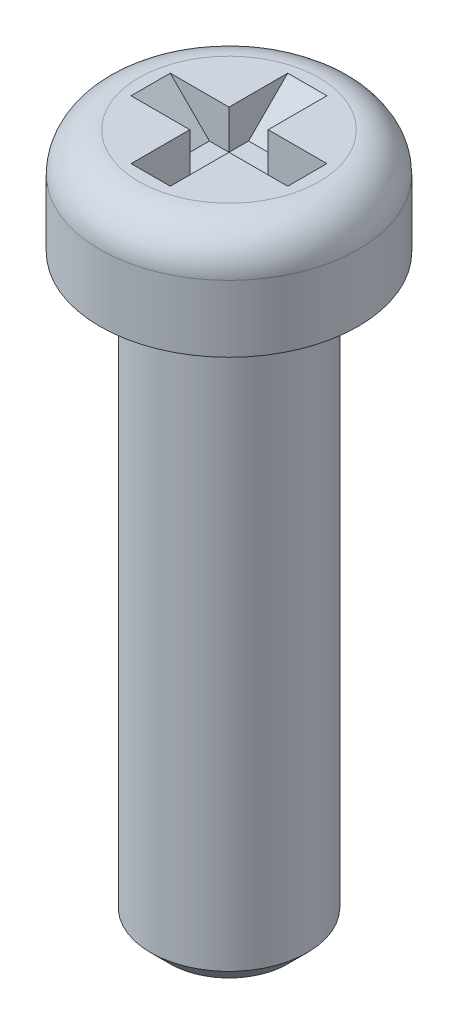
ISO-10303-21;
HEADER;
FILE_DESCRIPTION(('STEP AP214'),'2;1');
FILE_NAME('part.step','',(''),(''),'','','');
FILE_SCHEMA(('AUTOMOTIVE_DESIGN { 1 0 10303 214 1 1 1 1 }'));
ENDSEC;
DATA;
#1=APPLICATION_CONTEXT('core data for automotive mechanical design processes');
#2=APPLICATION_PROTOCOL_DEFINITION('international standard','automotive_design',2000,#1);
#3=PRODUCT_CONTEXT('',#1,'mechanical');
#4=PRODUCT('Part','Part','',(#3));
#5=PRODUCT_RELATED_PRODUCT_CATEGORY('part','',(#4));
#6=PRODUCT_DEFINITION_FORMATION('','',#4);
#7=PRODUCT_DEFINITION_CONTEXT('part definition',#1,'design');
#8=PRODUCT_DEFINITION('design','',#6,#7);
#9=PRODUCT_DEFINITION_SHAPE('','',#8);
#10=(LENGTH_UNIT() NAMED_UNIT(*) SI_UNIT(.MILLI.,.METRE.));
#11=(NAMED_UNIT(*) PLANE_ANGLE_UNIT() SI_UNIT($,.RADIAN.));
#12=(NAMED_UNIT(*) SI_UNIT($,.STERADIAN.) SOLID_ANGLE_UNIT());
#13=UNCERTAINTY_MEASURE_WITH_UNIT(LENGTH_MEASURE(1.E-05),#10,'distance_accuracy_value','');
#14=(GEOMETRIC_REPRESENTATION_CONTEXT(3) GLOBAL_UNCERTAINTY_ASSIGNED_CONTEXT((#13)) GLOBAL_UNIT_ASSIGNED_CONTEXT((#10,
#11,#12)) REPRESENTATION_CONTEXT('',''));
#15=CARTESIAN_POINT('',(0.,0.,0.));
#16=DIRECTION('',(0.,0.,1.));
#17=DIRECTION('',(1.,0.,0.));
#18=AXIS2_PLACEMENT_3D('',#15,#16,#17);
#19=CARTESIAN_POINT('',(0.,15.,0.));
#20=DIRECTION('',(0.,-1.,0.));
#21=DIRECTION('',(0.,0.,-1.));
#22=AXIS2_PLACEMENT_3D('',#19,#20,#21);
#23=CYLINDRICAL_SURFACE('',#22,2.);
#24=CARTESIAN_POINT('',(0.,0.500000000000006,0.));
#25=DIRECTION('',(0.,1.,0.));
#26=DIRECTION('',(0.,0.,1.));
#27=AXIS2_PLACEMENT_3D('',#24,#25,#26);
#28=CIRCLE('',#27,2.);
#29=CARTESIAN_POINT('',(0.,0.500000000000006,2.));
#30=VERTEX_POINT('',#29);
#31=EDGE_CURVE('E245',#30,#30,#28,.T.);
#32=ORIENTED_EDGE('',*,*,#31,.T.);
#33=EDGE_LOOP('',(#32));
#34=FACE_BOUND('',#33,.T.);
#35=CARTESIAN_POINT('',(0.,15.,0.));
#36=DIRECTION('',(0.,1.,0.));
#37=DIRECTION('',(0.,0.,1.));
#38=AXIS2_PLACEMENT_3D('',#35,#36,#37);
#39=CIRCLE('',#38,2.);
#40=CARTESIAN_POINT('',(0.,15.,2.));
#41=VERTEX_POINT('',#40);
#42=EDGE_CURVE('E231',#41,#41,#39,.T.);
#43=ORIENTED_EDGE('',*,*,#42,.F.);
#44=EDGE_LOOP('',(#43));
#45=FACE_BOUND('',#44,.T.);
#46=ADVANCED_FACE('F67',(#34,#45),#23,.T.);
#47=CARTESIAN_POINT('',(0.,0.,0.));
#48=DIRECTION('',(0.,1.,0.));
#49=DIRECTION('',(0.,0.,1.));
#50=AXIS2_PLACEMENT_3D('',#47,#48,#49);
#51=PLANE('',#50);
#52=CARTESIAN_POINT('',(0.,0.,0.));
#53=DIRECTION('',(0.,1.,0.));
#54=DIRECTION('',(0.,0.,1.));
#55=AXIS2_PLACEMENT_3D('',#52,#53,#54);
#56=CIRCLE('',#55,1.49999999999999);
#57=CARTESIAN_POINT('',(0.,0.,1.49999999999999));
#58=VERTEX_POINT('',#57);
#59=EDGE_CURVE('E244',#58,#58,#56,.F.);
#60=ORIENTED_EDGE('',*,*,#59,.T.);
#61=EDGE_LOOP('',(#60));
#62=FACE_BOUND('',#61,.T.);
#63=ADVANCED_FACE('F309',(#62),#51,.F.);
#64=CARTESIAN_POINT('',(0.,17.7,0.));
#65=DIRECTION('',(0.,-1.,0.));
#66=DIRECTION('',(0.,0.,-1.));
#67=AXIS2_PLACEMENT_3D('',#64,#65,#66);
#68=CYLINDRICAL_SURFACE('',#67,3.3);
#69=CARTESIAN_POINT('',(0.,16.7,0.));
#70=DIRECTION('',(0.,1.,0.));
#71=DIRECTION('',(0.,0.,1.));
#72=AXIS2_PLACEMENT_3D('',#69,#70,#71);
#73=CIRCLE('',#72,3.3);
#74=CARTESIAN_POINT('',(0.,16.7,-3.3));
#75=VERTEX_POINT('',#74);
#76=EDGE_CURVE('E237',#75,#75,#73,.F.);
#77=CARTESIAN_POINT('',(0.,15.,0.));
#78=DIRECTION('',(0.,1.,0.));
#79=DIRECTION('',(0.,0.,1.));
#80=AXIS2_PLACEMENT_3D('',#77,#78,#79);
#81=CIRCLE('',#80,3.3);
#82=CARTESIAN_POINT('',(0.,15.,-3.3));
#83=VERTEX_POINT('',#82);
#84=EDGE_CURVE('E216',#83,#83,#81,.T.);
#85=CARTESIAN_POINT('',(0.,16.7,-3.3));
#86=CARTESIAN_POINT('',(0.,16.6822916666667,-3.3));
#87=CARTESIAN_POINT('',(0.,16.6645833333333,-3.3));
#88=CARTESIAN_POINT('',(0.,16.6291666666667,-3.3));
#89=CARTESIAN_POINT('',(0.,16.6114583333333,-3.3));
#90=CARTESIAN_POINT('',(0.,16.5760416666667,-3.3));
#91=CARTESIAN_POINT('',(0.,16.5583333333333,-3.3));
#92=CARTESIAN_POINT('',(0.,16.5229166666667,-3.3));
#93=CARTESIAN_POINT('',(0.,16.5052083333333,-3.3));
#94=CARTESIAN_POINT('',(0.,16.4697916666667,-3.3));
#95=CARTESIAN_POINT('',(0.,16.4520833333333,-3.3));
#96=CARTESIAN_POINT('',(0.,16.4166666666667,-3.3));
#97=CARTESIAN_POINT('',(0.,16.3989583333333,-3.3));
#98=CARTESIAN_POINT('',(0.,16.3635416666667,-3.3));
#99=CARTESIAN_POINT('',(0.,16.3458333333333,-3.3));
#100=CARTESIAN_POINT('',(0.,16.3104166666667,-3.3));
#101=CARTESIAN_POINT('',(0.,16.2927083333333,-3.3));
#102=CARTESIAN_POINT('',(0.,16.2572916666667,-3.3));
#103=CARTESIAN_POINT('',(0.,16.2395833333333,-3.3));
#104=CARTESIAN_POINT('',(0.,16.2041666666667,-3.3));
#105=CARTESIAN_POINT('',(0.,16.1864583333333,-3.3));
#106=CARTESIAN_POINT('',(0.,16.1510416666667,-3.3));
#107=CARTESIAN_POINT('',(0.,16.1333333333333,-3.3));
#108=CARTESIAN_POINT('',(0.,16.0979166666667,-3.3));
#109=CARTESIAN_POINT('',(0.,16.0802083333333,-3.3));
#110=CARTESIAN_POINT('',(0.,16.0447916666667,-3.3));
#111=CARTESIAN_POINT('',(0.,16.0270833333333,-3.3));
#112=CARTESIAN_POINT('',(0.,15.9916666666667,-3.3));
#113=CARTESIAN_POINT('',(0.,15.9739583333333,-3.3));
#114=CARTESIAN_POINT('',(0.,15.9385416666667,-3.3));
#115=CARTESIAN_POINT('',(0.,15.9208333333333,-3.3));
#116=CARTESIAN_POINT('',(0.,15.8854166666667,-3.3));
#117=CARTESIAN_POINT('',(0.,15.8677083333333,-3.3));
#118=CARTESIAN_POINT('',(0.,15.8322916666667,-3.3));
#119=CARTESIAN_POINT('',(0.,15.8145833333333,-3.3));
#120=CARTESIAN_POINT('',(0.,15.7791666666667,-3.3));
#121=CARTESIAN_POINT('',(0.,15.7614583333333,-3.3));
#122=CARTESIAN_POINT('',(0.,15.7260416666667,-3.3));
#123=CARTESIAN_POINT('',(0.,15.7083333333333,-3.3));
#124=CARTESIAN_POINT('',(0.,15.6729166666667,-3.3));
#125=CARTESIAN_POINT('',(0.,15.6552083333333,-3.3));
#126=CARTESIAN_POINT('',(0.,15.6197916666667,-3.3));
#127=CARTESIAN_POINT('',(0.,15.6020833333333,-3.3));
#128=CARTESIAN_POINT('',(0.,15.5666666666667,-3.3));
#129=CARTESIAN_POINT('',(0.,15.5489583333333,-3.3));
#130=CARTESIAN_POINT('',(0.,15.5135416666667,-3.3));
#131=CARTESIAN_POINT('',(0.,15.4958333333333,-3.3));
#132=CARTESIAN_POINT('',(0.,15.4604166666667,-3.3));
#133=CARTESIAN_POINT('',(0.,15.4427083333333,-3.3));
#134=CARTESIAN_POINT('',(0.,15.4072916666667,-3.3));
#135=CARTESIAN_POINT('',(0.,15.3895833333333,-3.3));
#136=CARTESIAN_POINT('',(0.,15.3541666666667,-3.3));
#137=CARTESIAN_POINT('',(0.,15.3364583333333,-3.3));
#138=CARTESIAN_POINT('',(0.,15.3010416666667,-3.3));
#139=CARTESIAN_POINT('',(0.,15.2833333333333,-3.3));
#140=CARTESIAN_POINT('',(0.,15.2479166666667,-3.3));
#141=CARTESIAN_POINT('',(0.,15.2302083333333,-3.3));
#142=CARTESIAN_POINT('',(0.,15.1947916666667,-3.3));
#143=CARTESIAN_POINT('',(0.,15.1770833333333,-3.3));
#144=CARTESIAN_POINT('',(0.,15.1416666666667,-3.3));
#145=CARTESIAN_POINT('',(0.,15.1239583333333,-3.3));
#146=CARTESIAN_POINT('',(0.,15.0885416666667,-3.3));
#147=CARTESIAN_POINT('',(0.,15.0708333333333,-3.3));
#148=CARTESIAN_POINT('',(0.,15.0354166666667,-3.3));
#149=CARTESIAN_POINT('',(0.,15.0177083333333,-3.3));
#150=CARTESIAN_POINT('',(0.,15.,-3.3));
#151=B_SPLINE_CURVE_WITH_KNOTS('',3,(#85,#86,#87,#88,#89,#90,#91,#92,#93,#94,#95,#96,#97,#98,
#99,#100,#101,#102,#103,#104,#105,#106,#107,#108,#109,#110,#111,#112,#113,#114,#115,#116,#117,
#118,#119,#120,#121,#122,#123,#124,#125,#126,#127,#128,#129,#130,#131,#132,#133,#134,#135,#136,
#137,#138,#139,#140,#141,#142,#143,#144,#145,#146,#147,#148,#149,#150),.UNSPECIFIED.,.F.,.F.,(4,
2,2,2,2,2,2,2,2,2,2,2,2,2,2,2,2,2,2,2,2,2,2,2,2,2,2,2,2,2,2,2,4),(0.,0.0531249999999976,
0.106249999999999,0.159375,0.212499999999997,0.265624999999999,0.31875,0.371874999999997,
0.424999999999998,0.478124999999999,0.531249999999997,0.584374999999998,0.637499999999999,
0.690624999999997,0.743749999999998,0.796874999999999,0.85,0.903124999999998,0.956249999999999,
1.009375,1.0625,1.115625,1.16875,1.221875,1.275,1.328125,1.38125,1.434375,1.4875,1.540625,
1.59375,1.646875,1.7),.UNSPECIFIED.);
#152=EDGE_CURVE('BSEAM317',#75,#83,#151,.T.);
#153=ORIENTED_EDGE('',*,*,#76,.T.);
#154=ORIENTED_EDGE('',*,*,#84,.T.);
#155=ORIENTED_EDGE('',*,*,#152,.T.);
#156=ORIENTED_EDGE('',*,*,#152,.F.);
#157=EDGE_LOOP('',(#153,#155,#154,#156));
#158=FACE_BOUND('',#157,.T.);
#159=ADVANCED_FACE('F317',(#158),#68,.T.);
#160=CARTESIAN_POINT('',(0.,17.7,0.));
#161=DIRECTION('',(0.,1.,0.));
#162=DIRECTION('',(0.,0.,1.));
#163=AXIS2_PLACEMENT_3D('',#160,#161,#162);
#164=PLANE('',#163);
#165=DIRECTION('',(0.,0.,-1.));
#166=VECTOR('',#165,1.);
#167=CARTESIAN_POINT('',(-0.5,17.7,-2.));
#168=LINE('',#167,#166);
#169=CARTESIAN_POINT('',(-0.5,17.7,-2.));
#170=VERTEX_POINT('',#169);
#171=CARTESIAN_POINT('',(-0.5,17.7,-0.5));
#172=VERTEX_POINT('',#171);
#173=EDGE_CURVE('E190',#170,#172,#168,.F.);
#174=ORIENTED_EDGE('',*,*,#173,.F.);
#175=DIRECTION('',(1.,0.,0.));
#176=VECTOR('',#175,1.);
#177=CARTESIAN_POINT('',(-0.5,17.7,-2.));
#178=LINE('',#177,#176);
#179=CARTESIAN_POINT('',(0.5,17.7,-2.));
#180=VERTEX_POINT('',#179);
#181=EDGE_CURVE('E193',#170,#180,#178,.T.);
#182=ORIENTED_EDGE('',*,*,#181,.T.);
#183=DIRECTION('',(0.,0.,-1.));
#184=VECTOR('',#183,1.);
#185=CARTESIAN_POINT('',(0.5,17.7,-2.));
#186=LINE('',#185,#184);
#187=CARTESIAN_POINT('',(0.5,17.7,-0.5));
#188=VERTEX_POINT('',#187);
#189=EDGE_CURVE('E185',#180,#188,#186,.F.);
#190=ORIENTED_EDGE('',*,*,#189,.T.);
#191=DIRECTION('',(1.,0.,0.));
#192=VECTOR('',#191,1.);
#193=CARTESIAN_POINT('',(-2.,17.7,-0.5));
#194=LINE('',#193,#192);
#195=CARTESIAN_POINT('',(2.,17.7,-0.500000000000001));
#196=VERTEX_POINT('',#195);
#197=EDGE_CURVE('E224',#188,#196,#194,.T.);
#198=ORIENTED_EDGE('',*,*,#197,.T.);
#199=DIRECTION('',(0.,0.,1.));
#200=VECTOR('',#199,1.);
#201=CARTESIAN_POINT('',(2.,17.7,-0.500000000000001));
#202=LINE('',#201,#200);
#203=CARTESIAN_POINT('',(2.,17.7,0.499999999999999));
#204=VERTEX_POINT('',#203);
#205=EDGE_CURVE('E225',#196,#204,#202,.T.);
#206=ORIENTED_EDGE('',*,*,#205,.T.);
#207=DIRECTION('',(1.,0.,0.));
#208=VECTOR('',#207,1.);
#209=CARTESIAN_POINT('',(-2.,17.7,0.5));
#210=LINE('',#209,#208);
#211=CARTESIAN_POINT('',(0.5,17.7,0.5));
#212=VERTEX_POINT('',#211);
#213=EDGE_CURVE('E181',#212,#204,#210,.T.);
#214=ORIENTED_EDGE('',*,*,#213,.F.);
#215=CARTESIAN_POINT('',(0.5,17.7,2.));
#216=VERTEX_POINT('',#215);
#217=EDGE_CURVE('E162',#212,#216,#186,.F.);
#218=ORIENTED_EDGE('',*,*,#217,.T.);
#219=DIRECTION('',(-1.,0.,0.));
#220=VECTOR('',#219,1.);
#221=CARTESIAN_POINT('',(0.5,17.7,2.));
#222=LINE('',#221,#220);
#223=CARTESIAN_POINT('',(-0.5,17.7,2.));
#224=VERTEX_POINT('',#223);
#225=EDGE_CURVE('E178',#216,#224,#222,.T.);
#226=ORIENTED_EDGE('',*,*,#225,.T.);
#227=CARTESIAN_POINT('',(-0.5,17.7,0.5));
#228=VERTEX_POINT('',#227);
#229=EDGE_CURVE('E188',#228,#224,#168,.F.);
#230=ORIENTED_EDGE('',*,*,#229,.F.);
#231=CARTESIAN_POINT('',(-2.,17.7,0.5));
#232=VERTEX_POINT('',#231);
#233=EDGE_CURVE('E217',#232,#228,#210,.T.);
#234=ORIENTED_EDGE('',*,*,#233,.F.);
#235=DIRECTION('',(0.,0.,-1.));
#236=VECTOR('',#235,1.);
#237=CARTESIAN_POINT('',(-2.,17.7,0.5));
#238=LINE('',#237,#236);
#239=CARTESIAN_POINT('',(-2.,17.7,-0.5));
#240=VERTEX_POINT('',#239);
#241=EDGE_CURVE('E226',#232,#240,#238,.T.);
#242=ORIENTED_EDGE('',*,*,#241,.T.);
#243=EDGE_CURVE('E221',#240,#172,#194,.T.);
#244=ORIENTED_EDGE('',*,*,#243,.T.);
#245=EDGE_LOOP('',(#174,#182,#190,#198,#206,#214,#218,#226,#230,#234,#242,#244));
#246=FACE_BOUND('',#245,.T.);
#247=CARTESIAN_POINT('',(0.,17.7,0.));
#248=DIRECTION('',(0.,1.,0.));
#249=DIRECTION('',(0.,0.,1.));
#250=AXIS2_PLACEMENT_3D('',#247,#248,#249);
#251=CIRCLE('',#250,2.3);
#252=CARTESIAN_POINT('',(0.,17.7,2.3));
#253=VERTEX_POINT('',#252);
#254=EDGE_CURVE('E236',#253,#253,#251,.T.);
#255=ORIENTED_EDGE('',*,*,#254,.T.);
#256=EDGE_LOOP('',(#255));
#257=FACE_BOUND('',#256,.T.);
#258=ADVANCED_FACE('F174',(#246,#257),#164,.T.);
#259=CARTESIAN_POINT('',(0.,15.,0.));
#260=DIRECTION('',(0.,1.,0.));
#261=DIRECTION('',(0.,0.,1.));
#262=AXIS2_PLACEMENT_3D('',#259,#260,#261);
#263=PLANE('',#262);
#264=ORIENTED_EDGE('',*,*,#42,.T.);
#265=EDGE_LOOP('',(#264));
#266=FACE_BOUND('',#265,.T.);
#267=ORIENTED_EDGE('',*,*,#84,.F.);
#268=EDGE_LOOP('',(#267));
#269=FACE_BOUND('',#268,.T.);
#270=ADVANCED_FACE('F324',(#266,#269),#263,.F.);
#271=CARTESIAN_POINT('',(0.,16.7,0.));
#272=DIRECTION('',(0.,1.,0.));
#273=DIRECTION('',(0.,0.,1.));
#274=AXIS2_PLACEMENT_3D('',#271,#272,#273);
#275=TOROIDAL_SURFACE('',#274,2.3,1.);
#276=ORIENTED_EDGE('',*,*,#76,.F.);
#277=EDGE_LOOP('',(#276));
#278=FACE_BOUND('',#277,.T.);
#279=ORIENTED_EDGE('',*,*,#254,.F.);
#280=EDGE_LOOP('',(#279));
#281=FACE_BOUND('',#280,.T.);
#282=ADVANCED_FACE('F302',(#278,#281),#275,.T.);
#283=CARTESIAN_POINT('',(0.,0.500000000000006,0.));
#284=DIRECTION('',(0.,1.,0.));
#285=DIRECTION('',(0.,0.,1.));
#286=AXIS2_PLACEMENT_3D('',#283,#284,#285);
#287=CONICAL_SURFACE('',#286,2.,0.785398163397452);
#288=ORIENTED_EDGE('',*,*,#59,.F.);
#289=EDGE_LOOP('',(#288));
#290=FACE_BOUND('',#289,.T.);
#291=ORIENTED_EDGE('',*,*,#31,.F.);
#292=EDGE_LOOP('',(#291));
#293=FACE_BOUND('',#292,.T.);
#294=ADVANCED_FACE('F298',(#290,#293),#287,.T.);
#295=CARTESIAN_POINT('',(-2.,16.7,0.5));
#296=DIRECTION('',(0.,0.,1.));
#297=DIRECTION('',(1.,0.,0.));
#298=AXIS2_PLACEMENT_3D('',#295,#296,#297);
#299=PLANE('',#298);
#300=ORIENTED_EDGE('',*,*,#213,.T.);
#301=DIRECTION('',(-0.707106781186544,-0.707106781186551,0.));
#302=VECTOR('',#301,1.);
#303=CARTESIAN_POINT('',(2.,17.7,0.499999999999999));
#304=LINE('',#303,#302);
#305=CARTESIAN_POINT('',(1.,16.7,0.5));
#306=VERTEX_POINT('',#305);
#307=EDGE_CURVE('E166',#204,#306,#304,.T.);
#308=ORIENTED_EDGE('',*,*,#307,.T.);
#309=DIRECTION('',(1.,0.,0.));
#310=VECTOR('',#309,1.);
#311=CARTESIAN_POINT('',(-2.,16.7,0.5));
#312=LINE('',#311,#310);
#313=CARTESIAN_POINT('',(0.5,16.7,0.5));
#314=VERTEX_POINT('',#313);
#315=EDGE_CURVE('E211',#314,#306,#312,.T.);
#316=ORIENTED_EDGE('',*,*,#315,.F.);
#317=DIRECTION('',(0.,-1.,0.));
#318=VECTOR('',#317,1.);
#319=CARTESIAN_POINT('',(0.5,16.7,0.5));
#320=LINE('',#319,#318);
#321=EDGE_CURVE('E205',#212,#314,#320,.T.);
#322=ORIENTED_EDGE('',*,*,#321,.F.);
#323=EDGE_LOOP('',(#300,#308,#316,#322));
#324=FACE_BOUND('',#323,.T.);
#325=ADVANCED_FACE('F295',(#324),#299,.F.);
#326=CARTESIAN_POINT('',(-2.,16.7,-0.5));
#327=DIRECTION('',(0.,0.,1.));
#328=DIRECTION('',(1.,0.,0.));
#329=AXIS2_PLACEMENT_3D('',#326,#327,#328);
#330=PLANE('',#329);
#331=DIRECTION('',(1.,0.,0.));
#332=VECTOR('',#331,1.);
#333=CARTESIAN_POINT('',(-2.,16.7,-0.5));
#334=LINE('',#333,#332);
#335=CARTESIAN_POINT('',(0.5,16.7,-0.5));
#336=VERTEX_POINT('',#335);
#337=CARTESIAN_POINT('',(1.,16.7,-0.5));
#338=VERTEX_POINT('',#337);
#339=EDGE_CURVE('E214',#336,#338,#334,.T.);
#340=ORIENTED_EDGE('',*,*,#339,.T.);
#341=DIRECTION('',(0.707106781186544,0.707106781186551,0.));
#342=VECTOR('',#341,1.);
#343=CARTESIAN_POINT('',(-0.499999999999987,15.2,-0.5));
#344=LINE('',#343,#342);
#345=EDGE_CURVE('E257',#338,#196,#344,.T.);
#346=ORIENTED_EDGE('',*,*,#345,.T.);
#347=ORIENTED_EDGE('',*,*,#197,.F.);
#348=DIRECTION('',(0.,-1.,0.));
#349=VECTOR('',#348,1.);
#350=CARTESIAN_POINT('',(0.5,16.7,-0.5));
#351=LINE('',#350,#349);
#352=EDGE_CURVE('E197',#188,#336,#351,.T.);
#353=ORIENTED_EDGE('',*,*,#352,.T.);
#354=EDGE_LOOP('',(#340,#346,#347,#353));
#355=FACE_BOUND('',#354,.T.);
#356=ADVANCED_FACE('F290',(#355),#330,.T.);
#357=CARTESIAN_POINT('',(-1.,16.7,0.5));
#358=VERTEX_POINT('',#357);
#359=CARTESIAN_POINT('',(-0.5,16.7,0.5));
#360=VERTEX_POINT('',#359);
#361=EDGE_CURVE('E212',#358,#360,#312,.T.);
#362=ORIENTED_EDGE('',*,*,#361,.F.);
#363=DIRECTION('',(-0.707106781186544,0.707106781186551,0.));
#364=VECTOR('',#363,1.);
#365=CARTESIAN_POINT('',(-2.,17.7,0.5));
#366=LINE('',#365,#364);
#367=EDGE_CURVE('E12',#358,#232,#366,.T.);
#368=ORIENTED_EDGE('',*,*,#367,.T.);
#369=ORIENTED_EDGE('',*,*,#233,.T.);
#370=DIRECTION('',(0.,-1.,0.));
#371=VECTOR('',#370,1.);
#372=CARTESIAN_POINT('',(-0.5,16.7,0.5));
#373=LINE('',#372,#371);
#374=EDGE_CURVE('E206',#228,#360,#373,.T.);
#375=ORIENTED_EDGE('',*,*,#374,.T.);
#376=EDGE_LOOP('',(#362,#368,#369,#375));
#377=FACE_BOUND('',#376,.T.);
#378=ADVANCED_FACE('F274',(#377),#299,.F.);
#379=ORIENTED_EDGE('',*,*,#243,.F.);
#380=DIRECTION('',(0.707106781186544,-0.707106781186551,0.));
#381=VECTOR('',#380,1.);
#382=CARTESIAN_POINT('',(-1.5,17.2,-0.5));
#383=LINE('',#382,#381);
#384=CARTESIAN_POINT('',(-1.,16.7,-0.5));
#385=VERTEX_POINT('',#384);
#386=EDGE_CURVE('E76',#240,#385,#383,.T.);
#387=ORIENTED_EDGE('',*,*,#386,.T.);
#388=CARTESIAN_POINT('',(-0.5,16.7,-0.5));
#389=VERTEX_POINT('',#388);
#390=EDGE_CURVE('E213',#385,#389,#334,.T.);
#391=ORIENTED_EDGE('',*,*,#390,.T.);
#392=DIRECTION('',(0.,-1.,0.));
#393=VECTOR('',#392,1.);
#394=CARTESIAN_POINT('',(-0.5,16.7,-0.5));
#395=LINE('',#394,#393);
#396=EDGE_CURVE('E201',#172,#389,#395,.T.);
#397=ORIENTED_EDGE('',*,*,#396,.F.);
#398=EDGE_LOOP('',(#379,#387,#391,#397));
#399=FACE_BOUND('',#398,.T.);
#400=ADVANCED_FACE('F261',(#399),#330,.T.);
#401=CARTESIAN_POINT('',(0.,16.7,0.));
#402=DIRECTION('',(0.,-1.,0.));
#403=DIRECTION('',(-1.,0.,0.));
#404=AXIS2_PLACEMENT_3D('',#401,#402,#403);
#405=PLANE('',#404);
#406=DIRECTION('',(0.,0.,-1.));
#407=VECTOR('',#406,1.);
#408=CARTESIAN_POINT('',(-0.5,16.7,-2.));
#409=LINE('',#408,#407);
#410=CARTESIAN_POINT('',(-0.5,16.7,1.));
#411=VERTEX_POINT('',#410);
#412=EDGE_CURVE('E196',#360,#411,#409,.F.);
#413=ORIENTED_EDGE('',*,*,#412,.T.);
#414=DIRECTION('',(1.,0.,0.));
#415=VECTOR('',#414,1.);
#416=CARTESIAN_POINT('',(0.,16.7,1.));
#417=LINE('',#416,#415);
#418=CARTESIAN_POINT('',(0.5,16.7,1.));
#419=VERTEX_POINT('',#418);
#420=EDGE_CURVE('E169',#411,#419,#417,.T.);
#421=ORIENTED_EDGE('',*,*,#420,.T.);
#422=DIRECTION('',(0.,0.,-1.));
#423=VECTOR('',#422,1.);
#424=CARTESIAN_POINT('',(0.5,16.7,-2.));
#425=LINE('',#424,#423);
#426=EDGE_CURVE('E165',#314,#419,#425,.F.);
#427=ORIENTED_EDGE('',*,*,#426,.F.);
#428=ORIENTED_EDGE('',*,*,#315,.T.);
#429=DIRECTION('',(0.,0.,-1.));
#430=VECTOR('',#429,1.);
#431=CARTESIAN_POINT('',(1.,16.7,0.));
#432=LINE('',#431,#430);
#433=EDGE_CURVE('E255',#306,#338,#432,.T.);
#434=ORIENTED_EDGE('',*,*,#433,.T.);
#435=ORIENTED_EDGE('',*,*,#339,.F.);
#436=CARTESIAN_POINT('',(0.5,16.7,-1.));
#437=VERTEX_POINT('',#436);
#438=EDGE_CURVE('E203',#437,#336,#425,.F.);
#439=ORIENTED_EDGE('',*,*,#438,.F.);
#440=DIRECTION('',(-1.,0.,0.));
#441=VECTOR('',#440,1.);
#442=CARTESIAN_POINT('',(0.,16.7,-1.));
#443=LINE('',#442,#441);
#444=CARTESIAN_POINT('',(-0.5,16.7,-1.));
#445=VERTEX_POINT('',#444);
#446=EDGE_CURVE('E83',#437,#445,#443,.T.);
#447=ORIENTED_EDGE('',*,*,#446,.T.);
#448=EDGE_CURVE('E266',#445,#389,#409,.F.);
#449=ORIENTED_EDGE('',*,*,#448,.T.);
#450=ORIENTED_EDGE('',*,*,#390,.F.);
#451=DIRECTION('',(0.,0.,1.));
#452=VECTOR('',#451,1.);
#453=CARTESIAN_POINT('',(-1.,16.7,0.));
#454=LINE('',#453,#452);
#455=EDGE_CURVE('E248',#385,#358,#454,.T.);
#456=ORIENTED_EDGE('',*,*,#455,.T.);
#457=ORIENTED_EDGE('',*,*,#361,.T.);
#458=EDGE_LOOP('',(#413,#421,#427,#428,#434,#435,#439,#447,#449,#450,#456,#457));
#459=FACE_BOUND('',#458,.T.);
#460=ADVANCED_FACE('F268',(#459),#405,.F.);
#461=CARTESIAN_POINT('',(0.5,16.7,-2.));
#462=DIRECTION('',(-1.,0.,0.));
#463=DIRECTION('',(0.,0.,1.));
#464=AXIS2_PLACEMENT_3D('',#461,#462,#463);
#465=PLANE('',#464);
#466=ORIENTED_EDGE('',*,*,#189,.F.);
#467=DIRECTION('',(0.,-0.707106781186551,0.707106781186544));
#468=VECTOR('',#467,1.);
#469=CARTESIAN_POINT('',(0.5,17.2,-1.5));
#470=LINE('',#469,#468);
#471=EDGE_CURVE('E93',#180,#437,#470,.T.);
#472=ORIENTED_EDGE('',*,*,#471,.T.);
#473=ORIENTED_EDGE('',*,*,#438,.T.);
#474=ORIENTED_EDGE('',*,*,#352,.F.);
#475=EDGE_LOOP('',(#466,#472,#473,#474));
#476=FACE_BOUND('',#475,.T.);
#477=ADVANCED_FACE('F283',(#476),#465,.T.);
#478=CARTESIAN_POINT('',(-0.5,16.7,-2.));
#479=DIRECTION('',(-1.,0.,0.));
#480=DIRECTION('',(0.,0.,1.));
#481=AXIS2_PLACEMENT_3D('',#478,#479,#480);
#482=PLANE('',#481);
#483=ORIENTED_EDGE('',*,*,#448,.F.);
#484=DIRECTION('',(0.,0.707106781186551,-0.707106781186544));
#485=VECTOR('',#484,1.);
#486=CARTESIAN_POINT('',(-0.5,17.7,-2.));
#487=LINE('',#486,#485);
#488=EDGE_CURVE('E256',#445,#170,#487,.T.);
#489=ORIENTED_EDGE('',*,*,#488,.T.);
#490=ORIENTED_EDGE('',*,*,#173,.T.);
#491=ORIENTED_EDGE('',*,*,#396,.T.);
#492=EDGE_LOOP('',(#483,#489,#490,#491));
#493=FACE_BOUND('',#492,.T.);
#494=ADVANCED_FACE('F349',(#493),#482,.F.);
#495=ORIENTED_EDGE('',*,*,#229,.T.);
#496=DIRECTION('',(0.,-0.707106781186551,-0.707106781186544));
#497=VECTOR('',#496,1.);
#498=CARTESIAN_POINT('',(-0.5,17.7,2.));
#499=LINE('',#498,#497);
#500=EDGE_CURVE('E184',#224,#411,#499,.T.);
#501=ORIENTED_EDGE('',*,*,#500,.T.);
#502=ORIENTED_EDGE('',*,*,#412,.F.);
#503=ORIENTED_EDGE('',*,*,#374,.F.);
#504=EDGE_LOOP('',(#495,#501,#502,#503));
#505=FACE_BOUND('',#504,.T.);
#506=ADVANCED_FACE('F277',(#505),#482,.F.);
#507=ORIENTED_EDGE('',*,*,#426,.T.);
#508=DIRECTION('',(0.,0.707106781186551,0.707106781186544));
#509=VECTOR('',#508,1.);
#510=CARTESIAN_POINT('',(0.5,15.2,-0.499999999999987));
#511=LINE('',#510,#509);
#512=EDGE_CURVE('E158',#419,#216,#511,.T.);
#513=ORIENTED_EDGE('',*,*,#512,.T.);
#514=ORIENTED_EDGE('',*,*,#217,.F.);
#515=ORIENTED_EDGE('',*,*,#321,.T.);
#516=EDGE_LOOP('',(#507,#513,#514,#515));
#517=FACE_BOUND('',#516,.T.);
#518=ADVANCED_FACE('F156',(#517),#465,.T.);
#519=CARTESIAN_POINT('',(0.5,17.7,2.));
#520=DIRECTION('',(0.,-0.707106781186544,0.707106781186551));
#521=DIRECTION('',(-1.,0.,0.));
#522=AXIS2_PLACEMENT_3D('',#519,#520,#521);
#523=PLANE('',#522);
#524=ORIENTED_EDGE('',*,*,#512,.F.);
#525=ORIENTED_EDGE('',*,*,#420,.F.);
#526=ORIENTED_EDGE('',*,*,#500,.F.);
#527=ORIENTED_EDGE('',*,*,#225,.F.);
#528=EDGE_LOOP('',(#524,#525,#526,#527));
#529=FACE_BOUND('',#528,.T.);
#530=ADVANCED_FACE('F183',(#529),#523,.F.);
#531=CARTESIAN_POINT('',(2.,17.7,-0.500000000000001));
#532=DIRECTION('',(0.707106781186551,-0.707106781186544,0.));
#533=DIRECTION('',(0.,0.,1.));
#534=AXIS2_PLACEMENT_3D('',#531,#532,#533);
#535=PLANE('',#534);
#536=ORIENTED_EDGE('',*,*,#345,.F.);
#537=ORIENTED_EDGE('',*,*,#433,.F.);
#538=ORIENTED_EDGE('',*,*,#307,.F.);
#539=ORIENTED_EDGE('',*,*,#205,.F.);
#540=EDGE_LOOP('',(#536,#537,#538,#539));
#541=FACE_BOUND('',#540,.T.);
#542=ADVANCED_FACE('F293',(#541),#535,.F.);
#543=CARTESIAN_POINT('',(-0.5,17.7,-2.));
#544=DIRECTION('',(0.,-0.707106781186544,-0.707106781186551));
#545=DIRECTION('',(1.,0.,0.));
#546=AXIS2_PLACEMENT_3D('',#543,#544,#545);
#547=PLANE('',#546);
#548=ORIENTED_EDGE('',*,*,#488,.F.);
#549=ORIENTED_EDGE('',*,*,#446,.F.);
#550=ORIENTED_EDGE('',*,*,#471,.F.);
#551=ORIENTED_EDGE('',*,*,#181,.F.);
#552=EDGE_LOOP('',(#548,#549,#550,#551));
#553=FACE_BOUND('',#552,.T.);
#554=ADVANCED_FACE('F339',(#553),#547,.F.);
#555=CARTESIAN_POINT('',(-2.,17.7,0.5));
#556=DIRECTION('',(-0.707106781186551,-0.707106781186544,0.));
#557=DIRECTION('',(0.,0.,-1.));
#558=AXIS2_PLACEMENT_3D('',#555,#556,#557);
#559=PLANE('',#558);
#560=ORIENTED_EDGE('',*,*,#367,.F.);
#561=ORIENTED_EDGE('',*,*,#455,.F.);
#562=ORIENTED_EDGE('',*,*,#386,.F.);
#563=ORIENTED_EDGE('',*,*,#241,.F.);
#564=EDGE_LOOP('',(#560,#561,#562,#563));
#565=FACE_BOUND('',#564,.T.);
#566=ADVANCED_FACE('F75',(#565),#559,.F.);
#567=CLOSED_SHELL('',(#46,#63,#159,#258,#270,#282,#294,#325,#356,#378,#400,#460,#477,#494,#506,
#518,#530,#542,#554,#566));
#568=MANIFOLD_SOLID_BREP('B2',#567);
#569=ADVANCED_BREP_SHAPE_REPRESENTATION('',(#18,#568),#14);
#570=SHAPE_DEFINITION_REPRESENTATION(#9,#569);
ENDSEC;
END-ISO-10303-21;
